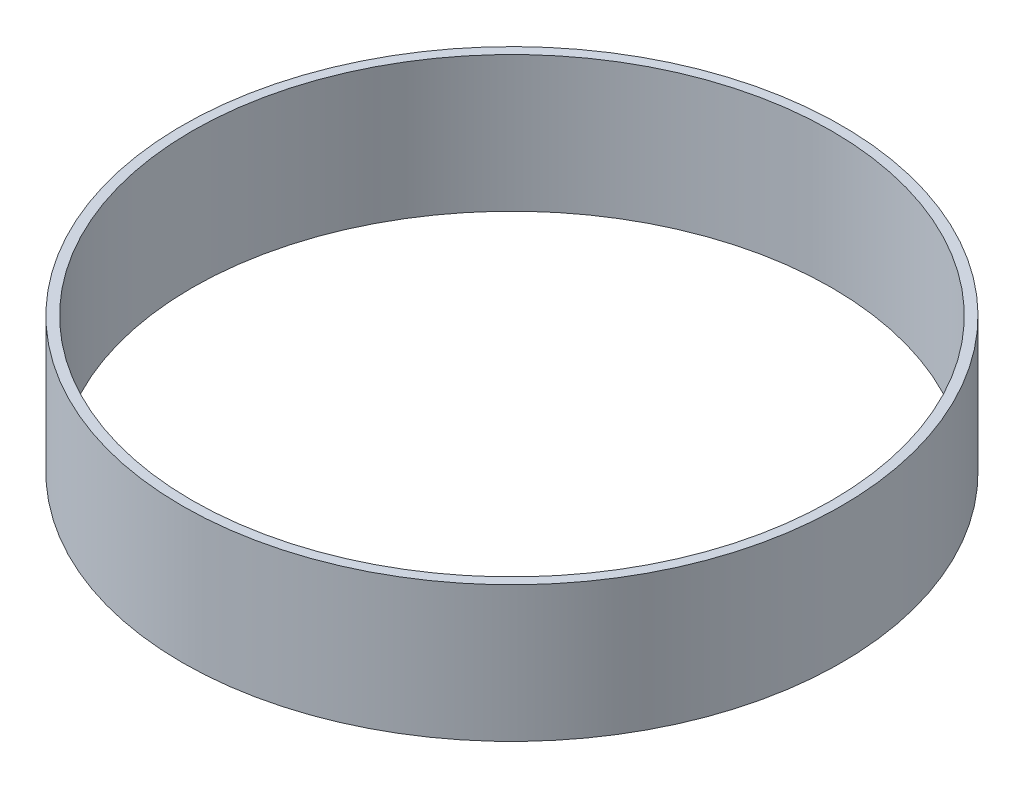
ISO-10303-21;
HEADER;
FILE_DESCRIPTION(('STEP AP214'),'2;1');
FILE_NAME('part.step','',(''),(''),'','','');
FILE_SCHEMA(('AUTOMOTIVE_DESIGN { 1 0 10303 214 1 1 1 1 }'));
ENDSEC;
DATA;
#1=APPLICATION_CONTEXT('core data for automotive mechanical design processes');
#2=APPLICATION_PROTOCOL_DEFINITION('international standard','automotive_design',2000,#1);
#3=PRODUCT_CONTEXT('',#1,'mechanical');
#4=PRODUCT('Part','Part','',(#3));
#5=PRODUCT_RELATED_PRODUCT_CATEGORY('part','',(#4));
#6=PRODUCT_DEFINITION_FORMATION('','',#4);
#7=PRODUCT_DEFINITION_CONTEXT('part definition',#1,'design');
#8=PRODUCT_DEFINITION('design','',#6,#7);
#9=PRODUCT_DEFINITION_SHAPE('','',#8);
#10=(LENGTH_UNIT() NAMED_UNIT(*) SI_UNIT(.MILLI.,.METRE.));
#11=(NAMED_UNIT(*) PLANE_ANGLE_UNIT() SI_UNIT($,.RADIAN.));
#12=(NAMED_UNIT(*) SI_UNIT($,.STERADIAN.) SOLID_ANGLE_UNIT());
#13=UNCERTAINTY_MEASURE_WITH_UNIT(LENGTH_MEASURE(1.E-05),#10,'distance_accuracy_value','');
#14=(GEOMETRIC_REPRESENTATION_CONTEXT(3) GLOBAL_UNCERTAINTY_ASSIGNED_CONTEXT((#13)) GLOBAL_UNIT_ASSIGNED_CONTEXT((#10,
#11,#12)) REPRESENTATION_CONTEXT('',''));
#15=CARTESIAN_POINT('',(0.,0.,0.));
#16=DIRECTION('',(0.,0.,1.));
#17=DIRECTION('',(1.,0.,0.));
#18=AXIS2_PLACEMENT_3D('',#15,#16,#17);
#19=CARTESIAN_POINT('',(-34.,-7.,0.));
#20=DIRECTION('',(0.,-1.,0.));
#21=DIRECTION('',(0.,0.,-1.));
#22=AXIS2_PLACEMENT_3D('',#19,#20,#21);
#23=PLANE('',#22);
#24=CARTESIAN_POINT('',(0.,-7.,0.));
#25=DIRECTION('',(0.,1.,0.));
#26=DIRECTION('',(0.,0.,1.));
#27=AXIS2_PLACEMENT_3D('',#24,#25,#26);
#28=CIRCLE('',#27,33.);
#29=CARTESIAN_POINT('',(0.,-7.,33.));
#30=VERTEX_POINT('',#29);
#31=EDGE_CURVE('E12',#30,#30,#28,.T.);
#32=ORIENTED_EDGE('',*,*,#31,.T.);
#33=EDGE_LOOP('',(#32));
#34=FACE_BOUND('',#33,.T.);
#35=CARTESIAN_POINT('',(0.,-7.,0.));
#36=DIRECTION('',(0.,1.,0.));
#37=DIRECTION('',(0.,0.,1.));
#38=AXIS2_PLACEMENT_3D('',#35,#36,#37);
#39=CIRCLE('',#38,34.);
#40=CARTESIAN_POINT('',(0.,-7.,34.));
#41=VERTEX_POINT('',#40);
#42=EDGE_CURVE('E56',#41,#41,#39,.T.);
#43=ORIENTED_EDGE('',*,*,#42,.F.);
#44=EDGE_LOOP('',(#43));
#45=FACE_BOUND('',#44,.T.);
#46=ADVANCED_FACE('F42',(#34,#45),#23,.T.);
#47=CARTESIAN_POINT('',(0.,0.,0.));
#48=DIRECTION('',(0.,1.,0.));
#49=DIRECTION('',(0.,0.,1.));
#50=AXIS2_PLACEMENT_3D('',#47,#48,#49);
#51=CYLINDRICAL_SURFACE('',#50,33.);
#52=CARTESIAN_POINT('',(0.,7.,0.));
#53=DIRECTION('',(0.,1.,0.));
#54=DIRECTION('',(0.,0.,1.));
#55=AXIS2_PLACEMENT_3D('',#52,#53,#54);
#56=CIRCLE('',#55,33.);
#57=CARTESIAN_POINT('',(0.,7.,33.));
#58=VERTEX_POINT('',#57);
#59=EDGE_CURVE('E48',#58,#58,#56,.T.);
#60=ORIENTED_EDGE('',*,*,#59,.T.);
#61=EDGE_LOOP('',(#60));
#62=FACE_BOUND('',#61,.T.);
#63=ORIENTED_EDGE('',*,*,#31,.F.);
#64=EDGE_LOOP('',(#63));
#65=FACE_BOUND('',#64,.T.);
#66=ADVANCED_FACE('F66',(#62,#65),#51,.F.);
#67=CARTESIAN_POINT('',(-33.,7.,0.));
#68=DIRECTION('',(0.,1.,0.));
#69=DIRECTION('',(0.,0.,1.));
#70=AXIS2_PLACEMENT_3D('',#67,#68,#69);
#71=PLANE('',#70);
#72=CARTESIAN_POINT('',(0.,7.,0.));
#73=DIRECTION('',(0.,1.,0.));
#74=DIRECTION('',(0.,0.,1.));
#75=AXIS2_PLACEMENT_3D('',#72,#73,#74);
#76=CIRCLE('',#75,34.);
#77=CARTESIAN_POINT('',(0.,7.,34.));
#78=VERTEX_POINT('',#77);
#79=EDGE_CURVE('E52',#78,#78,#76,.T.);
#80=ORIENTED_EDGE('',*,*,#79,.T.);
#81=EDGE_LOOP('',(#80));
#82=FACE_BOUND('',#81,.T.);
#83=ORIENTED_EDGE('',*,*,#59,.F.);
#84=EDGE_LOOP('',(#83));
#85=FACE_BOUND('',#84,.T.);
#86=ADVANCED_FACE('F70',(#82,#85),#71,.T.);
#87=CARTESIAN_POINT('',(0.,0.,0.));
#88=DIRECTION('',(0.,1.,0.));
#89=DIRECTION('',(0.,0.,1.));
#90=AXIS2_PLACEMENT_3D('',#87,#88,#89);
#91=CYLINDRICAL_SURFACE('',#90,34.);
#92=ORIENTED_EDGE('',*,*,#42,.T.);
#93=EDGE_LOOP('',(#92));
#94=FACE_BOUND('',#93,.T.);
#95=ORIENTED_EDGE('',*,*,#79,.F.);
#96=EDGE_LOOP('',(#95));
#97=FACE_BOUND('',#96,.T.);
#98=ADVANCED_FACE('F62',(#94,#97),#91,.T.);
#99=CLOSED_SHELL('',(#46,#66,#86,#98));
#100=MANIFOLD_SOLID_BREP('B2',#99);
#101=ADVANCED_BREP_SHAPE_REPRESENTATION('',(#18,#100),#14);
#102=SHAPE_DEFINITION_REPRESENTATION(#9,#101);
ENDSEC;
END-ISO-10303-21;
